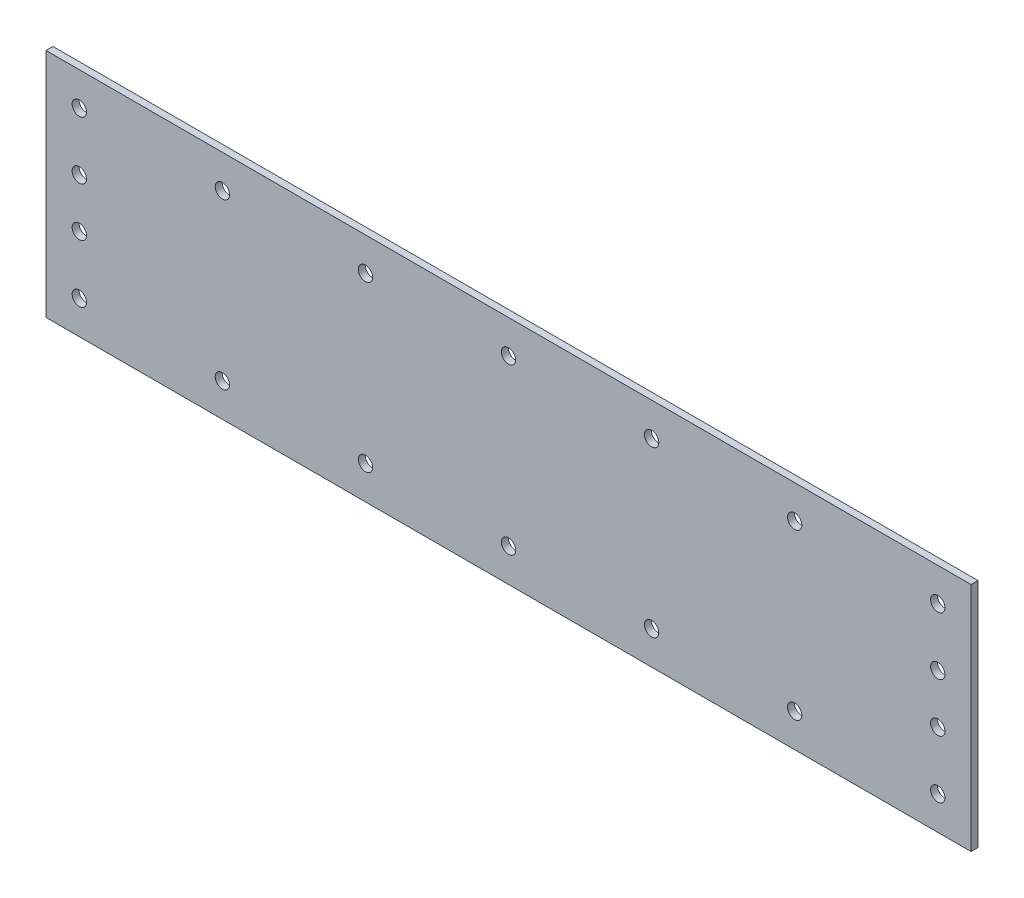
ISO-10303-21;
HEADER;
FILE_DESCRIPTION(('STEP AP214'),'2;1');
FILE_NAME('part.step','',(''),(''),'','','');
FILE_SCHEMA(('AUTOMOTIVE_DESIGN { 1 0 10303 214 1 1 1 1 }'));
ENDSEC;
DATA;
#1=APPLICATION_CONTEXT('core data for automotive mechanical design processes');
#2=APPLICATION_PROTOCOL_DEFINITION('international standard','automotive_design',2000,#1);
#3=PRODUCT_CONTEXT('',#1,'mechanical');
#4=PRODUCT('Part','Part','',(#3));
#5=PRODUCT_RELATED_PRODUCT_CATEGORY('part','',(#4));
#6=PRODUCT_DEFINITION_FORMATION('','',#4);
#7=PRODUCT_DEFINITION_CONTEXT('part definition',#1,'design');
#8=PRODUCT_DEFINITION('design','',#6,#7);
#9=PRODUCT_DEFINITION_SHAPE('','',#8);
#10=(LENGTH_UNIT() NAMED_UNIT(*) SI_UNIT(.MILLI.,.METRE.));
#11=(NAMED_UNIT(*) PLANE_ANGLE_UNIT() SI_UNIT($,.RADIAN.));
#12=(NAMED_UNIT(*) SI_UNIT($,.STERADIAN.) SOLID_ANGLE_UNIT());
#13=UNCERTAINTY_MEASURE_WITH_UNIT(LENGTH_MEASURE(1.E-05),#10,'distance_accuracy_value','');
#14=(GEOMETRIC_REPRESENTATION_CONTEXT(3) GLOBAL_UNCERTAINTY_ASSIGNED_CONTEXT((#13)) GLOBAL_UNIT_ASSIGNED_CONTEXT((#10,
#11,#12)) REPRESENTATION_CONTEXT('',''));
#15=CARTESIAN_POINT('',(0.,0.,0.));
#16=DIRECTION('',(0.,0.,1.));
#17=DIRECTION('',(1.,0.,0.));
#18=AXIS2_PLACEMENT_3D('',#15,#16,#17);
#19=CARTESIAN_POINT('',(200.,0.,-228.));
#20=DIRECTION('',(-1.,0.,0.));
#21=DIRECTION('',(0.,0.,1.));
#22=AXIS2_PLACEMENT_3D('',#19,#20,#21);
#23=PLANE('',#22);
#24=DIRECTION('',(0.,-1.,0.));
#25=VECTOR('',#24,1.);
#26=CARTESIAN_POINT('',(200.,0.,-225.));
#27=LINE('',#26,#25);
#28=CARTESIAN_POINT('',(200.,50.,-225.));
#29=VERTEX_POINT('',#28);
#30=CARTESIAN_POINT('',(200.,-50.,-225.));
#31=VERTEX_POINT('',#30);
#32=EDGE_CURVE('E163',#29,#31,#27,.T.);
#33=ORIENTED_EDGE('',*,*,#32,.T.);
#34=DIRECTION('',(0.,0.,1.));
#35=VECTOR('',#34,1.);
#36=CARTESIAN_POINT('',(200.,-50.,-228.));
#37=LINE('',#36,#35);
#38=CARTESIAN_POINT('',(200.,-50.,-228.));
#39=VERTEX_POINT('',#38);
#40=EDGE_CURVE('E11',#39,#31,#37,.T.);
#41=ORIENTED_EDGE('',*,*,#40,.F.);
#42=DIRECTION('',(0.,-1.,0.));
#43=VECTOR('',#42,1.);
#44=CARTESIAN_POINT('',(200.,0.,-228.));
#45=LINE('',#44,#43);
#46=CARTESIAN_POINT('',(200.,50.,-228.));
#47=VERTEX_POINT('',#46);
#48=EDGE_CURVE('E64',#47,#39,#45,.T.);
#49=ORIENTED_EDGE('',*,*,#48,.F.);
#50=DIRECTION('',(0.,0.,1.));
#51=VECTOR('',#50,1.);
#52=CARTESIAN_POINT('',(200.,50.,-228.));
#53=LINE('',#52,#51);
#54=EDGE_CURVE('E49',#47,#29,#53,.T.);
#55=ORIENTED_EDGE('',*,*,#54,.T.);
#56=EDGE_LOOP('',(#33,#41,#49,#55));
#57=FACE_BOUND('',#56,.T.);
#58=ADVANCED_FACE('F45',(#57),#23,.F.);
#59=CARTESIAN_POINT('',(0.,-50.,-228.));
#60=DIRECTION('',(0.,-1.,0.));
#61=DIRECTION('',(0.,0.,-1.));
#62=AXIS2_PLACEMENT_3D('',#59,#60,#61);
#63=PLANE('',#62);
#64=DIRECTION('',(1.,0.,0.));
#65=VECTOR('',#64,1.);
#66=CARTESIAN_POINT('',(0.,-50.,-225.));
#67=LINE('',#66,#65);
#68=CARTESIAN_POINT('',(-200.,-50.,-225.));
#69=VERTEX_POINT('',#68);
#70=EDGE_CURVE('E168',#69,#31,#67,.T.);
#71=ORIENTED_EDGE('',*,*,#70,.F.);
#72=DIRECTION('',(0.,0.,1.));
#73=VECTOR('',#72,1.);
#74=CARTESIAN_POINT('',(-200.,-50.,-228.));
#75=LINE('',#74,#73);
#76=CARTESIAN_POINT('',(-200.,-50.,-228.));
#77=VERTEX_POINT('',#76);
#78=EDGE_CURVE('E55',#77,#69,#75,.T.);
#79=ORIENTED_EDGE('',*,*,#78,.F.);
#80=DIRECTION('',(1.,0.,0.));
#81=VECTOR('',#80,1.);
#82=CARTESIAN_POINT('',(0.,-50.,-228.));
#83=LINE('',#82,#81);
#84=EDGE_CURVE('E104',#77,#39,#83,.T.);
#85=ORIENTED_EDGE('',*,*,#84,.T.);
#86=ORIENTED_EDGE('',*,*,#40,.T.);
#87=EDGE_LOOP('',(#71,#79,#85,#86));
#88=FACE_BOUND('',#87,.T.);
#89=ADVANCED_FACE('F249',(#88),#63,.T.);
#90=CARTESIAN_POINT('',(-200.,0.,-228.));
#91=DIRECTION('',(-1.,0.,0.));
#92=DIRECTION('',(0.,0.,1.));
#93=AXIS2_PLACEMENT_3D('',#90,#91,#92);
#94=PLANE('',#93);
#95=DIRECTION('',(0.,-1.,0.));
#96=VECTOR('',#95,1.);
#97=CARTESIAN_POINT('',(-200.,0.,-225.));
#98=LINE('',#97,#96);
#99=CARTESIAN_POINT('',(-200.,50.,-225.));
#100=VERTEX_POINT('',#99);
#101=EDGE_CURVE('E96',#100,#69,#98,.T.);
#102=ORIENTED_EDGE('',*,*,#101,.F.);
#103=DIRECTION('',(0.,0.,1.));
#104=VECTOR('',#103,1.);
#105=CARTESIAN_POINT('',(-200.,50.,-228.));
#106=LINE('',#105,#104);
#107=CARTESIAN_POINT('',(-200.,50.,-228.));
#108=VERTEX_POINT('',#107);
#109=EDGE_CURVE('E93',#108,#100,#106,.T.);
#110=ORIENTED_EDGE('',*,*,#109,.F.);
#111=DIRECTION('',(0.,-1.,0.));
#112=VECTOR('',#111,1.);
#113=CARTESIAN_POINT('',(-200.,0.,-228.));
#114=LINE('',#113,#112);
#115=EDGE_CURVE('E95',#108,#77,#114,.T.);
#116=ORIENTED_EDGE('',*,*,#115,.T.);
#117=ORIENTED_EDGE('',*,*,#78,.T.);
#118=EDGE_LOOP('',(#102,#110,#116,#117));
#119=FACE_BOUND('',#118,.T.);
#120=ADVANCED_FACE('F94',(#119),#94,.T.);
#121=CARTESIAN_POINT('',(123.733333333333,35.6000000000043,-228.));
#122=DIRECTION('',(0.,0.,1.));
#123=DIRECTION('',(1.,0.,0.));
#124=AXIS2_PLACEMENT_3D('',#121,#122,#123);
#125=CYLINDRICAL_SURFACE('',#124,3.09999999999999);
#126=CARTESIAN_POINT('',(123.733333333333,35.6000000000043,-228.));
#127=DIRECTION('',(0.,0.,1.));
#128=DIRECTION('',(1.,0.,0.));
#129=AXIS2_PLACEMENT_3D('',#126,#127,#128);
#130=CIRCLE('',#129,3.09999999999999);
#131=CARTESIAN_POINT('',(126.833333333333,35.6000000000043,-228.));
#132=VERTEX_POINT('',#131);
#133=EDGE_CURVE('E139',#132,#132,#130,.T.);
#134=ORIENTED_EDGE('',*,*,#133,.F.);
#135=EDGE_LOOP('',(#134));
#136=FACE_BOUND('',#135,.T.);
#137=CARTESIAN_POINT('',(123.733333333333,35.6000000000043,-225.));
#138=DIRECTION('',(0.,0.,1.));
#139=DIRECTION('',(1.,0.,0.));
#140=AXIS2_PLACEMENT_3D('',#137,#138,#139);
#141=CIRCLE('',#140,3.09999999999999);
#142=CARTESIAN_POINT('',(126.833333333333,35.6000000000043,-225.));
#143=VERTEX_POINT('',#142);
#144=EDGE_CURVE('E201',#143,#143,#141,.T.);
#145=ORIENTED_EDGE('',*,*,#144,.T.);
#146=EDGE_LOOP('',(#145));
#147=FACE_BOUND('',#146,.T.);
#148=ADVANCED_FACE('F315',(#136,#147),#125,.F.);
#149=CARTESIAN_POINT('',(0.,-35.5999999999974,-228.));
#150=DIRECTION('',(0.,0.,1.));
#151=DIRECTION('',(1.,0.,0.));
#152=AXIS2_PLACEMENT_3D('',#149,#150,#151);
#153=CYLINDRICAL_SURFACE('',#152,3.09999999999999);
#154=CARTESIAN_POINT('',(0.,-35.5999999999974,-228.));
#155=DIRECTION('',(0.,0.,1.));
#156=DIRECTION('',(1.,0.,0.));
#157=AXIS2_PLACEMENT_3D('',#154,#155,#156);
#158=CIRCLE('',#157,3.09999999999999);
#159=CARTESIAN_POINT('',(3.09999999999996,-35.5999999999974,-228.));
#160=VERTEX_POINT('',#159);
#161=EDGE_CURVE('E136',#160,#160,#158,.F.);
#162=ORIENTED_EDGE('',*,*,#161,.T.);
#163=EDGE_LOOP('',(#162));
#164=FACE_BOUND('',#163,.T.);
#165=CARTESIAN_POINT('',(0.,-35.5999999999974,-225.));
#166=DIRECTION('',(0.,0.,1.));
#167=DIRECTION('',(1.,0.,0.));
#168=AXIS2_PLACEMENT_3D('',#165,#166,#167);
#169=CIRCLE('',#168,3.09999999999999);
#170=CARTESIAN_POINT('',(3.09999999999996,-35.5999999999974,-225.));
#171=VERTEX_POINT('',#170);
#172=EDGE_CURVE('E198',#171,#171,#169,.F.);
#173=ORIENTED_EDGE('',*,*,#172,.F.);
#174=EDGE_LOOP('',(#173));
#175=FACE_BOUND('',#174,.T.);
#176=ADVANCED_FACE('F317',(#164,#175),#153,.F.);
#177=CARTESIAN_POINT('',(0.,35.6000000000026,-228.));
#178=DIRECTION('',(0.,0.,1.));
#179=DIRECTION('',(1.,0.,0.));
#180=AXIS2_PLACEMENT_3D('',#177,#178,#179);
#181=CYLINDRICAL_SURFACE('',#180,3.09999999999999);
#182=CARTESIAN_POINT('',(0.,35.6000000000026,-228.));
#183=DIRECTION('',(0.,0.,1.));
#184=DIRECTION('',(1.,0.,0.));
#185=AXIS2_PLACEMENT_3D('',#182,#183,#184);
#186=CIRCLE('',#185,3.09999999999999);
#187=CARTESIAN_POINT('',(3.09999999999996,35.6000000000026,-228.));
#188=VERTEX_POINT('',#187);
#189=EDGE_CURVE('E133',#188,#188,#186,.T.);
#190=ORIENTED_EDGE('',*,*,#189,.F.);
#191=EDGE_LOOP('',(#190));
#192=FACE_BOUND('',#191,.T.);
#193=CARTESIAN_POINT('',(0.,35.6000000000026,-225.));
#194=DIRECTION('',(0.,0.,1.));
#195=DIRECTION('',(1.,0.,0.));
#196=AXIS2_PLACEMENT_3D('',#193,#194,#195);
#197=CIRCLE('',#196,3.09999999999999);
#198=CARTESIAN_POINT('',(3.09999999999996,35.6000000000026,-225.));
#199=VERTEX_POINT('',#198);
#200=EDGE_CURVE('E195',#199,#199,#197,.T.);
#201=ORIENTED_EDGE('',*,*,#200,.T.);
#202=EDGE_LOOP('',(#201));
#203=FACE_BOUND('',#202,.T.);
#204=ADVANCED_FACE('F324',(#192,#203),#181,.F.);
#205=CARTESIAN_POINT('',(-123.733333333333,-35.5999999999991,-228.));
#206=DIRECTION('',(0.,0.,1.));
#207=DIRECTION('',(1.,0.,0.));
#208=AXIS2_PLACEMENT_3D('',#205,#206,#207);
#209=CYLINDRICAL_SURFACE('',#208,3.09999999999999);
#210=CARTESIAN_POINT('',(-123.733333333333,-35.5999999999991,-228.));
#211=DIRECTION('',(0.,0.,1.));
#212=DIRECTION('',(1.,0.,0.));
#213=AXIS2_PLACEMENT_3D('',#210,#211,#212);
#214=CIRCLE('',#213,3.09999999999999);
#215=CARTESIAN_POINT('',(-120.633333333333,-35.5999999999991,-228.));
#216=VERTEX_POINT('',#215);
#217=EDGE_CURVE('E130',#216,#216,#214,.F.);
#218=ORIENTED_EDGE('',*,*,#217,.T.);
#219=EDGE_LOOP('',(#218));
#220=FACE_BOUND('',#219,.T.);
#221=CARTESIAN_POINT('',(-123.733333333333,-35.5999999999991,-225.));
#222=DIRECTION('',(0.,0.,1.));
#223=DIRECTION('',(1.,0.,0.));
#224=AXIS2_PLACEMENT_3D('',#221,#222,#223);
#225=CIRCLE('',#224,3.09999999999999);
#226=CARTESIAN_POINT('',(-120.633333333333,-35.5999999999991,-225.));
#227=VERTEX_POINT('',#226);
#228=EDGE_CURVE('E192',#227,#227,#225,.F.);
#229=ORIENTED_EDGE('',*,*,#228,.F.);
#230=EDGE_LOOP('',(#229));
#231=FACE_BOUND('',#230,.T.);
#232=ADVANCED_FACE('F331',(#220,#231),#209,.F.);
#233=CARTESIAN_POINT('',(-123.733333333333,35.6000000000009,-228.));
#234=DIRECTION('',(0.,0.,1.));
#235=DIRECTION('',(1.,0.,0.));
#236=AXIS2_PLACEMENT_3D('',#233,#234,#235);
#237=CYLINDRICAL_SURFACE('',#236,3.09999999999999);
#238=CARTESIAN_POINT('',(-123.733333333333,35.6000000000009,-228.));
#239=DIRECTION('',(0.,0.,1.));
#240=DIRECTION('',(1.,0.,0.));
#241=AXIS2_PLACEMENT_3D('',#238,#239,#240);
#242=CIRCLE('',#241,3.09999999999999);
#243=CARTESIAN_POINT('',(-120.633333333333,35.6000000000009,-228.));
#244=VERTEX_POINT('',#243);
#245=EDGE_CURVE('E127',#244,#244,#242,.T.);
#246=ORIENTED_EDGE('',*,*,#245,.F.);
#247=EDGE_LOOP('',(#246));
#248=FACE_BOUND('',#247,.T.);
#249=CARTESIAN_POINT('',(-123.733333333333,35.6000000000009,-225.));
#250=DIRECTION('',(0.,0.,1.));
#251=DIRECTION('',(1.,0.,0.));
#252=AXIS2_PLACEMENT_3D('',#249,#250,#251);
#253=CIRCLE('',#252,3.09999999999999);
#254=CARTESIAN_POINT('',(-120.633333333333,35.6000000000009,-225.));
#255=VERTEX_POINT('',#254);
#256=EDGE_CURVE('E189',#255,#255,#253,.T.);
#257=ORIENTED_EDGE('',*,*,#256,.T.);
#258=EDGE_LOOP('',(#257));
#259=FACE_BOUND('',#258,.T.);
#260=ADVANCED_FACE('F335',(#248,#259),#237,.F.);
#261=CARTESIAN_POINT('',(185.599999999999,10.6,-228.));
#262=DIRECTION('',(0.,0.,1.));
#263=DIRECTION('',(1.,0.,0.));
#264=AXIS2_PLACEMENT_3D('',#261,#262,#263);
#265=CYLINDRICAL_SURFACE('',#264,3.09999999999999);
#266=CARTESIAN_POINT('',(185.599999999999,10.6,-228.));
#267=DIRECTION('',(0.,0.,1.));
#268=DIRECTION('',(1.,0.,0.));
#269=AXIS2_PLACEMENT_3D('',#266,#267,#268);
#270=CIRCLE('',#269,3.09999999999999);
#271=CARTESIAN_POINT('',(188.699999999999,10.6,-228.));
#272=VERTEX_POINT('',#271);
#273=EDGE_CURVE('E124',#272,#272,#270,.F.);
#274=ORIENTED_EDGE('',*,*,#273,.T.);
#275=EDGE_LOOP('',(#274));
#276=FACE_BOUND('',#275,.T.);
#277=CARTESIAN_POINT('',(185.599999999999,10.6,-225.));
#278=DIRECTION('',(0.,0.,1.));
#279=DIRECTION('',(1.,0.,0.));
#280=AXIS2_PLACEMENT_3D('',#277,#278,#279);
#281=CIRCLE('',#280,3.09999999999999);
#282=CARTESIAN_POINT('',(188.699999999999,10.6,-225.));
#283=VERTEX_POINT('',#282);
#284=EDGE_CURVE('E186',#283,#283,#281,.F.);
#285=ORIENTED_EDGE('',*,*,#284,.F.);
#286=EDGE_LOOP('',(#285));
#287=FACE_BOUND('',#286,.T.);
#288=ADVANCED_FACE('F339',(#276,#287),#265,.F.);
#289=CARTESIAN_POINT('',(185.599999999999,-10.6,-228.));
#290=DIRECTION('',(0.,0.,1.));
#291=DIRECTION('',(1.,0.,0.));
#292=AXIS2_PLACEMENT_3D('',#289,#290,#291);
#293=CYLINDRICAL_SURFACE('',#292,3.09999999999999);
#294=CARTESIAN_POINT('',(185.599999999999,-10.6,-228.));
#295=DIRECTION('',(0.,0.,1.));
#296=DIRECTION('',(1.,0.,0.));
#297=AXIS2_PLACEMENT_3D('',#294,#295,#296);
#298=CIRCLE('',#297,3.09999999999999);
#299=CARTESIAN_POINT('',(188.699999999999,-10.6,-228.));
#300=VERTEX_POINT('',#299);
#301=EDGE_CURVE('E121',#300,#300,#298,.T.);
#302=ORIENTED_EDGE('',*,*,#301,.F.);
#303=EDGE_LOOP('',(#302));
#304=FACE_BOUND('',#303,.T.);
#305=CARTESIAN_POINT('',(185.599999999999,-10.6,-225.));
#306=DIRECTION('',(0.,0.,1.));
#307=DIRECTION('',(1.,0.,0.));
#308=AXIS2_PLACEMENT_3D('',#305,#306,#307);
#309=CIRCLE('',#308,3.09999999999999);
#310=CARTESIAN_POINT('',(188.699999999999,-10.6,-225.));
#311=VERTEX_POINT('',#310);
#312=EDGE_CURVE('E183',#311,#311,#309,.T.);
#313=ORIENTED_EDGE('',*,*,#312,.T.);
#314=EDGE_LOOP('',(#313));
#315=FACE_BOUND('',#314,.T.);
#316=ADVANCED_FACE('F343',(#304,#315),#293,.F.);
#317=CARTESIAN_POINT('',(185.6,-35.6,-228.));
#318=DIRECTION('',(0.,0.,1.));
#319=DIRECTION('',(1.,0.,0.));
#320=AXIS2_PLACEMENT_3D('',#317,#318,#319);
#321=CYLINDRICAL_SURFACE('',#320,3.09999999999999);
#322=CARTESIAN_POINT('',(185.6,-35.6,-228.));
#323=DIRECTION('',(0.,0.,1.));
#324=DIRECTION('',(1.,0.,0.));
#325=AXIS2_PLACEMENT_3D('',#322,#323,#324);
#326=CIRCLE('',#325,3.09999999999999);
#327=CARTESIAN_POINT('',(188.7,-35.6,-228.));
#328=VERTEX_POINT('',#327);
#329=EDGE_CURVE('E118',#328,#328,#326,.T.);
#330=ORIENTED_EDGE('',*,*,#329,.F.);
#331=EDGE_LOOP('',(#330));
#332=FACE_BOUND('',#331,.T.);
#333=CARTESIAN_POINT('',(185.6,-35.6,-225.));
#334=DIRECTION('',(0.,0.,1.));
#335=DIRECTION('',(1.,0.,0.));
#336=AXIS2_PLACEMENT_3D('',#333,#334,#335);
#337=CIRCLE('',#336,3.09999999999999);
#338=CARTESIAN_POINT('',(188.7,-35.6,-225.));
#339=VERTEX_POINT('',#338);
#340=EDGE_CURVE('E180',#339,#339,#337,.T.);
#341=ORIENTED_EDGE('',*,*,#340,.T.);
#342=EDGE_LOOP('',(#341));
#343=FACE_BOUND('',#342,.T.);
#344=ADVANCED_FACE('F347',(#332,#343),#321,.F.);
#345=CARTESIAN_POINT('',(-185.599999999999,-10.6,-228.));
#346=DIRECTION('',(0.,0.,1.));
#347=DIRECTION('',(1.,0.,0.));
#348=AXIS2_PLACEMENT_3D('',#345,#346,#347);
#349=CYLINDRICAL_SURFACE('',#348,3.09999999999999);
#350=CARTESIAN_POINT('',(-185.599999999999,-10.6,-228.));
#351=DIRECTION('',(0.,0.,1.));
#352=DIRECTION('',(1.,0.,0.));
#353=AXIS2_PLACEMENT_3D('',#350,#351,#352);
#354=CIRCLE('',#353,3.09999999999999);
#355=CARTESIAN_POINT('',(-182.499999999999,-10.6,-228.));
#356=VERTEX_POINT('',#355);
#357=EDGE_CURVE('E115',#356,#356,#354,.F.);
#358=ORIENTED_EDGE('',*,*,#357,.T.);
#359=EDGE_LOOP('',(#358));
#360=FACE_BOUND('',#359,.T.);
#361=CARTESIAN_POINT('',(-185.599999999999,-10.6,-225.));
#362=DIRECTION('',(0.,0.,1.));
#363=DIRECTION('',(1.,0.,0.));
#364=AXIS2_PLACEMENT_3D('',#361,#362,#363);
#365=CIRCLE('',#364,3.09999999999999);
#366=CARTESIAN_POINT('',(-182.499999999999,-10.6,-225.));
#367=VERTEX_POINT('',#366);
#368=EDGE_CURVE('E177',#367,#367,#365,.F.);
#369=ORIENTED_EDGE('',*,*,#368,.F.);
#370=EDGE_LOOP('',(#369));
#371=FACE_BOUND('',#370,.T.);
#372=ADVANCED_FACE('F351',(#360,#371),#349,.F.);
#373=CARTESIAN_POINT('',(-185.599999999999,10.6,-228.));
#374=DIRECTION('',(0.,0.,1.));
#375=DIRECTION('',(1.,0.,0.));
#376=AXIS2_PLACEMENT_3D('',#373,#374,#375);
#377=CYLINDRICAL_SURFACE('',#376,3.09999999999943);
#378=CARTESIAN_POINT('',(-185.599999999999,10.6,-228.));
#379=DIRECTION('',(0.,0.,1.));
#380=DIRECTION('',(1.,0.,0.));
#381=AXIS2_PLACEMENT_3D('',#378,#379,#380);
#382=CIRCLE('',#381,3.09999999999943);
#383=CARTESIAN_POINT('',(-182.5,10.6,-228.));
#384=VERTEX_POINT('',#383);
#385=EDGE_CURVE('E112',#384,#384,#382,.T.);
#386=ORIENTED_EDGE('',*,*,#385,.F.);
#387=EDGE_LOOP('',(#386));
#388=FACE_BOUND('',#387,.T.);
#389=CARTESIAN_POINT('',(-185.599999999999,10.6,-225.));
#390=DIRECTION('',(0.,0.,1.));
#391=DIRECTION('',(1.,0.,0.));
#392=AXIS2_PLACEMENT_3D('',#389,#390,#391);
#393=CIRCLE('',#392,3.09999999999943);
#394=CARTESIAN_POINT('',(-182.5,10.6,-225.));
#395=VERTEX_POINT('',#394);
#396=EDGE_CURVE('E174',#395,#395,#393,.T.);
#397=ORIENTED_EDGE('',*,*,#396,.T.);
#398=EDGE_LOOP('',(#397));
#399=FACE_BOUND('',#398,.T.);
#400=ADVANCED_FACE('F355',(#388,#399),#377,.F.);
#401=CARTESIAN_POINT('',(-185.6,35.6,-228.));
#402=DIRECTION('',(0.,0.,1.));
#403=DIRECTION('',(1.,0.,0.));
#404=AXIS2_PLACEMENT_3D('',#401,#402,#403);
#405=CYLINDRICAL_SURFACE('',#404,3.09999999999999);
#406=CARTESIAN_POINT('',(-185.6,35.6,-228.));
#407=DIRECTION('',(0.,0.,1.));
#408=DIRECTION('',(1.,0.,0.));
#409=AXIS2_PLACEMENT_3D('',#406,#407,#408);
#410=CIRCLE('',#409,3.09999999999999);
#411=CARTESIAN_POINT('',(-182.5,35.6,-228.));
#412=VERTEX_POINT('',#411);
#413=EDGE_CURVE('E106',#412,#412,#410,.T.);
#414=ORIENTED_EDGE('',*,*,#413,.F.);
#415=EDGE_LOOP('',(#414));
#416=FACE_BOUND('',#415,.T.);
#417=CARTESIAN_POINT('',(-185.6,35.6,-225.));
#418=DIRECTION('',(0.,0.,1.));
#419=DIRECTION('',(1.,0.,0.));
#420=AXIS2_PLACEMENT_3D('',#417,#418,#419);
#421=CIRCLE('',#420,3.09999999999999);
#422=CARTESIAN_POINT('',(-182.5,35.6,-225.));
#423=VERTEX_POINT('',#422);
#424=EDGE_CURVE('E171',#423,#423,#421,.T.);
#425=ORIENTED_EDGE('',*,*,#424,.T.);
#426=EDGE_LOOP('',(#425));
#427=FACE_BOUND('',#426,.T.);
#428=ADVANCED_FACE('F359',(#416,#427),#405,.F.);
#429=CARTESIAN_POINT('',(0.,50.,-228.));
#430=DIRECTION('',(0.,-1.,0.));
#431=DIRECTION('',(0.,0.,-1.));
#432=AXIS2_PLACEMENT_3D('',#429,#430,#431);
#433=PLANE('',#432);
#434=DIRECTION('',(1.,0.,0.));
#435=VECTOR('',#434,1.);
#436=CARTESIAN_POINT('',(0.,50.,-225.));
#437=LINE('',#436,#435);
#438=EDGE_CURVE('E165',#100,#29,#437,.T.);
#439=ORIENTED_EDGE('',*,*,#438,.T.);
#440=ORIENTED_EDGE('',*,*,#54,.F.);
#441=DIRECTION('',(1.,0.,0.));
#442=VECTOR('',#441,1.);
#443=CARTESIAN_POINT('',(0.,50.,-228.));
#444=LINE('',#443,#442);
#445=EDGE_CURVE('E90',#108,#47,#444,.T.);
#446=ORIENTED_EDGE('',*,*,#445,.F.);
#447=ORIENTED_EDGE('',*,*,#109,.T.);
#448=EDGE_LOOP('',(#439,#440,#446,#447));
#449=FACE_BOUND('',#448,.T.);
#450=ADVANCED_FACE('F99',(#449),#433,.F.);
#451=CARTESIAN_POINT('',(-185.6,-35.6,-228.));
#452=DIRECTION('',(0.,0.,1.));
#453=DIRECTION('',(1.,0.,0.));
#454=AXIS2_PLACEMENT_3D('',#451,#452,#453);
#455=CYLINDRICAL_SURFACE('',#454,3.09999999999999);
#456=CARTESIAN_POINT('',(-185.6,-35.6,-228.));
#457=DIRECTION('',(0.,0.,1.));
#458=DIRECTION('',(1.,0.,0.));
#459=AXIS2_PLACEMENT_3D('',#456,#457,#458);
#460=CIRCLE('',#459,3.09999999999999);
#461=CARTESIAN_POINT('',(-182.5,-35.6,-228.));
#462=VERTEX_POINT('',#461);
#463=EDGE_CURVE('E227',#462,#462,#460,.F.);
#464=ORIENTED_EDGE('',*,*,#463,.T.);
#465=EDGE_LOOP('',(#464));
#466=FACE_BOUND('',#465,.T.);
#467=CARTESIAN_POINT('',(-185.6,-35.6,-225.));
#468=DIRECTION('',(0.,0.,1.));
#469=DIRECTION('',(1.,0.,0.));
#470=AXIS2_PLACEMENT_3D('',#467,#468,#469);
#471=CIRCLE('',#470,3.09999999999999);
#472=CARTESIAN_POINT('',(-182.5,-35.6,-225.));
#473=VERTEX_POINT('',#472);
#474=EDGE_CURVE('E160',#473,#473,#471,.F.);
#475=ORIENTED_EDGE('',*,*,#474,.F.);
#476=EDGE_LOOP('',(#475));
#477=FACE_BOUND('',#476,.T.);
#478=ADVANCED_FACE('F231',(#466,#477),#455,.F.);
#479=CARTESIAN_POINT('',(185.6,35.6,-228.));
#480=DIRECTION('',(0.,0.,1.));
#481=DIRECTION('',(1.,0.,0.));
#482=AXIS2_PLACEMENT_3D('',#479,#480,#481);
#483=CYLINDRICAL_SURFACE('',#482,3.09999999999999);
#484=CARTESIAN_POINT('',(185.6,35.6,-228.));
#485=DIRECTION('',(0.,0.,1.));
#486=DIRECTION('',(1.,0.,0.));
#487=AXIS2_PLACEMENT_3D('',#484,#485,#486);
#488=CIRCLE('',#487,3.09999999999999);
#489=CARTESIAN_POINT('',(188.7,35.6,-228.));
#490=VERTEX_POINT('',#489);
#491=EDGE_CURVE('E224',#490,#490,#488,.F.);
#492=ORIENTED_EDGE('',*,*,#491,.T.);
#493=EDGE_LOOP('',(#492));
#494=FACE_BOUND('',#493,.T.);
#495=CARTESIAN_POINT('',(185.6,35.6,-225.));
#496=DIRECTION('',(0.,0.,1.));
#497=DIRECTION('',(1.,0.,0.));
#498=AXIS2_PLACEMENT_3D('',#495,#496,#497);
#499=CIRCLE('',#498,3.09999999999999);
#500=CARTESIAN_POINT('',(188.7,35.6,-225.));
#501=VERTEX_POINT('',#500);
#502=EDGE_CURVE('E157',#501,#501,#499,.F.);
#503=ORIENTED_EDGE('',*,*,#502,.F.);
#504=EDGE_LOOP('',(#503));
#505=FACE_BOUND('',#504,.T.);
#506=ADVANCED_FACE('F261',(#494,#505),#483,.F.);
#507=CARTESIAN_POINT('',(-61.8666666666666,35.6000000000017,-228.));
#508=DIRECTION('',(0.,0.,1.));
#509=DIRECTION('',(1.,0.,0.));
#510=AXIS2_PLACEMENT_3D('',#507,#508,#509);
#511=CYLINDRICAL_SURFACE('',#510,3.09999999999999);
#512=CARTESIAN_POINT('',(-61.8666666666666,35.6000000000017,-228.));
#513=DIRECTION('',(0.,0.,1.));
#514=DIRECTION('',(1.,0.,0.));
#515=AXIS2_PLACEMENT_3D('',#512,#513,#514);
#516=CIRCLE('',#515,3.09999999999999);
#517=CARTESIAN_POINT('',(-58.7666666666666,35.6000000000017,-228.));
#518=VERTEX_POINT('',#517);
#519=EDGE_CURVE('E221',#518,#518,#516,.T.);
#520=ORIENTED_EDGE('',*,*,#519,.F.);
#521=EDGE_LOOP('',(#520));
#522=FACE_BOUND('',#521,.T.);
#523=CARTESIAN_POINT('',(-61.8666666666666,35.6000000000017,-225.));
#524=DIRECTION('',(0.,0.,1.));
#525=DIRECTION('',(1.,0.,0.));
#526=AXIS2_PLACEMENT_3D('',#523,#524,#525);
#527=CIRCLE('',#526,3.09999999999999);
#528=CARTESIAN_POINT('',(-58.7666666666666,35.6000000000017,-225.));
#529=VERTEX_POINT('',#528);
#530=EDGE_CURVE('E154',#529,#529,#527,.T.);
#531=ORIENTED_EDGE('',*,*,#530,.T.);
#532=EDGE_LOOP('',(#531));
#533=FACE_BOUND('',#532,.T.);
#534=ADVANCED_FACE('F264',(#522,#533),#511,.F.);
#535=CARTESIAN_POINT('',(-61.8666666666666,-35.5999999999983,-228.));
#536=DIRECTION('',(0.,0.,1.));
#537=DIRECTION('',(1.,0.,0.));
#538=AXIS2_PLACEMENT_3D('',#535,#536,#537);
#539=CYLINDRICAL_SURFACE('',#538,3.09999999999999);
#540=CARTESIAN_POINT('',(-61.8666666666666,-35.5999999999983,-228.));
#541=DIRECTION('',(0.,0.,1.));
#542=DIRECTION('',(1.,0.,0.));
#543=AXIS2_PLACEMENT_3D('',#540,#541,#542);
#544=CIRCLE('',#543,3.09999999999999);
#545=CARTESIAN_POINT('',(-58.7666666666666,-35.5999999999983,-228.));
#546=VERTEX_POINT('',#545);
#547=EDGE_CURVE('E216',#546,#546,#544,.F.);
#548=ORIENTED_EDGE('',*,*,#547,.T.);
#549=EDGE_LOOP('',(#548));
#550=FACE_BOUND('',#549,.T.);
#551=CARTESIAN_POINT('',(-61.8666666666666,-35.5999999999983,-225.));
#552=DIRECTION('',(0.,0.,1.));
#553=DIRECTION('',(1.,0.,0.));
#554=AXIS2_PLACEMENT_3D('',#551,#552,#553);
#555=CIRCLE('',#554,3.09999999999999);
#556=CARTESIAN_POINT('',(-58.7666666666666,-35.5999999999983,-225.));
#557=VERTEX_POINT('',#556);
#558=EDGE_CURVE('E151',#557,#557,#555,.F.);
#559=ORIENTED_EDGE('',*,*,#558,.F.);
#560=EDGE_LOOP('',(#559));
#561=FACE_BOUND('',#560,.T.);
#562=ADVANCED_FACE('F268',(#550,#561),#539,.F.);
#563=CARTESIAN_POINT('',(61.8666666666665,35.6000000000035,-228.));
#564=DIRECTION('',(0.,0.,1.));
#565=DIRECTION('',(1.,0.,0.));
#566=AXIS2_PLACEMENT_3D('',#563,#564,#565);
#567=CYLINDRICAL_SURFACE('',#566,3.09999999999999);
#568=CARTESIAN_POINT('',(61.8666666666665,35.6000000000035,-228.));
#569=DIRECTION('',(0.,0.,1.));
#570=DIRECTION('',(1.,0.,0.));
#571=AXIS2_PLACEMENT_3D('',#568,#569,#570);
#572=CIRCLE('',#571,3.09999999999999);
#573=CARTESIAN_POINT('',(64.9666666666665,35.6000000000035,-228.));
#574=VERTEX_POINT('',#573);
#575=EDGE_CURVE('E211',#574,#574,#572,.T.);
#576=ORIENTED_EDGE('',*,*,#575,.F.);
#577=EDGE_LOOP('',(#576));
#578=FACE_BOUND('',#577,.T.);
#579=CARTESIAN_POINT('',(61.8666666666665,35.6000000000035,-225.));
#580=DIRECTION('',(0.,0.,1.));
#581=DIRECTION('',(1.,0.,0.));
#582=AXIS2_PLACEMENT_3D('',#579,#580,#581);
#583=CIRCLE('',#582,3.09999999999999);
#584=CARTESIAN_POINT('',(64.9666666666665,35.6000000000035,-225.));
#585=VERTEX_POINT('',#584);
#586=EDGE_CURVE('E148',#585,#585,#583,.T.);
#587=ORIENTED_EDGE('',*,*,#586,.T.);
#588=EDGE_LOOP('',(#587));
#589=FACE_BOUND('',#588,.T.);
#590=ADVANCED_FACE('F271',(#578,#589),#567,.F.);
#591=CARTESIAN_POINT('',(61.8666666666665,-35.5999999999965,-228.));
#592=DIRECTION('',(0.,0.,1.));
#593=DIRECTION('',(1.,0.,0.));
#594=AXIS2_PLACEMENT_3D('',#591,#592,#593);
#595=CYLINDRICAL_SURFACE('',#594,3.09999999999999);
#596=CARTESIAN_POINT('',(61.8666666666665,-35.5999999999965,-228.));
#597=DIRECTION('',(0.,0.,1.));
#598=DIRECTION('',(1.,0.,0.));
#599=AXIS2_PLACEMENT_3D('',#596,#597,#598);
#600=CIRCLE('',#599,3.09999999999999);
#601=CARTESIAN_POINT('',(64.9666666666665,-35.5999999999965,-228.));
#602=VERTEX_POINT('',#601);
#603=EDGE_CURVE('E206',#602,#602,#600,.F.);
#604=ORIENTED_EDGE('',*,*,#603,.T.);
#605=EDGE_LOOP('',(#604));
#606=FACE_BOUND('',#605,.T.);
#607=CARTESIAN_POINT('',(61.8666666666665,-35.5999999999965,-225.));
#608=DIRECTION('',(0.,0.,1.));
#609=DIRECTION('',(1.,0.,0.));
#610=AXIS2_PLACEMENT_3D('',#607,#608,#609);
#611=CIRCLE('',#610,3.09999999999999);
#612=CARTESIAN_POINT('',(64.9666666666665,-35.5999999999965,-225.));
#613=VERTEX_POINT('',#612);
#614=EDGE_CURVE('E145',#613,#613,#611,.F.);
#615=ORIENTED_EDGE('',*,*,#614,.F.);
#616=EDGE_LOOP('',(#615));
#617=FACE_BOUND('',#616,.T.);
#618=ADVANCED_FACE('F47',(#606,#617),#595,.F.);
#619=CARTESIAN_POINT('',(123.733333333333,-35.5999999999957,-228.));
#620=DIRECTION('',(0.,0.,1.));
#621=DIRECTION('',(1.,0.,0.));
#622=AXIS2_PLACEMENT_3D('',#619,#620,#621);
#623=CYLINDRICAL_SURFACE('',#622,3.09999999999999);
#624=CARTESIAN_POINT('',(123.733333333333,-35.5999999999957,-228.));
#625=DIRECTION('',(0.,0.,1.));
#626=DIRECTION('',(1.,0.,0.));
#627=AXIS2_PLACEMENT_3D('',#624,#625,#626);
#628=CIRCLE('',#627,3.09999999999999);
#629=CARTESIAN_POINT('',(126.833333333333,-35.5999999999957,-228.));
#630=VERTEX_POINT('',#629);
#631=EDGE_CURVE('E142',#630,#630,#628,.F.);
#632=ORIENTED_EDGE('',*,*,#631,.T.);
#633=EDGE_LOOP('',(#632));
#634=FACE_BOUND('',#633,.T.);
#635=CARTESIAN_POINT('',(123.733333333333,-35.5999999999957,-225.));
#636=DIRECTION('',(0.,0.,1.));
#637=DIRECTION('',(1.,0.,0.));
#638=AXIS2_PLACEMENT_3D('',#635,#636,#637);
#639=CIRCLE('',#638,3.09999999999999);
#640=CARTESIAN_POINT('',(126.833333333333,-35.5999999999957,-225.));
#641=VERTEX_POINT('',#640);
#642=EDGE_CURVE('E204',#641,#641,#639,.F.);
#643=ORIENTED_EDGE('',*,*,#642,.F.);
#644=EDGE_LOOP('',(#643));
#645=FACE_BOUND('',#644,.T.);
#646=ADVANCED_FACE('F236',(#634,#645),#623,.F.);
#647=CARTESIAN_POINT('',(0.,0.,-228.));
#648=DIRECTION('',(0.,0.,1.));
#649=DIRECTION('',(1.,0.,0.));
#650=AXIS2_PLACEMENT_3D('',#647,#648,#649);
#651=PLANE('',#650);
#652=ORIENTED_EDGE('',*,*,#603,.F.);
#653=EDGE_LOOP('',(#652));
#654=FACE_BOUND('',#653,.T.);
#655=ORIENTED_EDGE('',*,*,#575,.T.);
#656=EDGE_LOOP('',(#655));
#657=FACE_BOUND('',#656,.T.);
#658=ORIENTED_EDGE('',*,*,#547,.F.);
#659=EDGE_LOOP('',(#658));
#660=FACE_BOUND('',#659,.T.);
#661=ORIENTED_EDGE('',*,*,#519,.T.);
#662=EDGE_LOOP('',(#661));
#663=FACE_BOUND('',#662,.T.);
#664=ORIENTED_EDGE('',*,*,#491,.F.);
#665=EDGE_LOOP('',(#664));
#666=FACE_BOUND('',#665,.T.);
#667=ORIENTED_EDGE('',*,*,#463,.F.);
#668=EDGE_LOOP('',(#667));
#669=FACE_BOUND('',#668,.T.);
#670=ORIENTED_EDGE('',*,*,#48,.T.);
#671=ORIENTED_EDGE('',*,*,#84,.F.);
#672=ORIENTED_EDGE('',*,*,#115,.F.);
#673=ORIENTED_EDGE('',*,*,#445,.T.);
#674=EDGE_LOOP('',(#670,#671,#672,#673));
#675=FACE_BOUND('',#674,.T.);
#676=ORIENTED_EDGE('',*,*,#413,.T.);
#677=EDGE_LOOP('',(#676));
#678=FACE_BOUND('',#677,.T.);
#679=ORIENTED_EDGE('',*,*,#385,.T.);
#680=EDGE_LOOP('',(#679));
#681=FACE_BOUND('',#680,.T.);
#682=ORIENTED_EDGE('',*,*,#357,.F.);
#683=EDGE_LOOP('',(#682));
#684=FACE_BOUND('',#683,.T.);
#685=ORIENTED_EDGE('',*,*,#329,.T.);
#686=EDGE_LOOP('',(#685));
#687=FACE_BOUND('',#686,.T.);
#688=ORIENTED_EDGE('',*,*,#301,.T.);
#689=EDGE_LOOP('',(#688));
#690=FACE_BOUND('',#689,.T.);
#691=ORIENTED_EDGE('',*,*,#273,.F.);
#692=EDGE_LOOP('',(#691));
#693=FACE_BOUND('',#692,.T.);
#694=ORIENTED_EDGE('',*,*,#245,.T.);
#695=EDGE_LOOP('',(#694));
#696=FACE_BOUND('',#695,.T.);
#697=ORIENTED_EDGE('',*,*,#217,.F.);
#698=EDGE_LOOP('',(#697));
#699=FACE_BOUND('',#698,.T.);
#700=ORIENTED_EDGE('',*,*,#189,.T.);
#701=EDGE_LOOP('',(#700));
#702=FACE_BOUND('',#701,.T.);
#703=ORIENTED_EDGE('',*,*,#161,.F.);
#704=EDGE_LOOP('',(#703));
#705=FACE_BOUND('',#704,.T.);
#706=ORIENTED_EDGE('',*,*,#133,.T.);
#707=EDGE_LOOP('',(#706));
#708=FACE_BOUND('',#707,.T.);
#709=ORIENTED_EDGE('',*,*,#631,.F.);
#710=EDGE_LOOP('',(#709));
#711=FACE_BOUND('',#710,.T.);
#712=ADVANCED_FACE('F102',(#654,#657,#660,#663,#666,#669,#675,#678,#681,#684,#687,#690,#693,
#696,#699,#702,#705,#708,#711),#651,.F.);
#713=CARTESIAN_POINT('',(0.,0.,-225.));
#714=DIRECTION('',(0.,0.,1.));
#715=DIRECTION('',(1.,0.,0.));
#716=AXIS2_PLACEMENT_3D('',#713,#714,#715);
#717=PLANE('',#716);
#718=ORIENTED_EDGE('',*,*,#614,.T.);
#719=EDGE_LOOP('',(#718));
#720=FACE_BOUND('',#719,.T.);
#721=ORIENTED_EDGE('',*,*,#586,.F.);
#722=EDGE_LOOP('',(#721));
#723=FACE_BOUND('',#722,.T.);
#724=ORIENTED_EDGE('',*,*,#558,.T.);
#725=EDGE_LOOP('',(#724));
#726=FACE_BOUND('',#725,.T.);
#727=ORIENTED_EDGE('',*,*,#530,.F.);
#728=EDGE_LOOP('',(#727));
#729=FACE_BOUND('',#728,.T.);
#730=ORIENTED_EDGE('',*,*,#502,.T.);
#731=EDGE_LOOP('',(#730));
#732=FACE_BOUND('',#731,.T.);
#733=ORIENTED_EDGE('',*,*,#474,.T.);
#734=EDGE_LOOP('',(#733));
#735=FACE_BOUND('',#734,.T.);
#736=ORIENTED_EDGE('',*,*,#32,.F.);
#737=ORIENTED_EDGE('',*,*,#438,.F.);
#738=ORIENTED_EDGE('',*,*,#101,.T.);
#739=ORIENTED_EDGE('',*,*,#70,.T.);
#740=EDGE_LOOP('',(#736,#737,#738,#739));
#741=FACE_BOUND('',#740,.T.);
#742=ORIENTED_EDGE('',*,*,#424,.F.);
#743=EDGE_LOOP('',(#742));
#744=FACE_BOUND('',#743,.T.);
#745=ORIENTED_EDGE('',*,*,#396,.F.);
#746=EDGE_LOOP('',(#745));
#747=FACE_BOUND('',#746,.T.);
#748=ORIENTED_EDGE('',*,*,#368,.T.);
#749=EDGE_LOOP('',(#748));
#750=FACE_BOUND('',#749,.T.);
#751=ORIENTED_EDGE('',*,*,#340,.F.);
#752=EDGE_LOOP('',(#751));
#753=FACE_BOUND('',#752,.T.);
#754=ORIENTED_EDGE('',*,*,#312,.F.);
#755=EDGE_LOOP('',(#754));
#756=FACE_BOUND('',#755,.T.);
#757=ORIENTED_EDGE('',*,*,#284,.T.);
#758=EDGE_LOOP('',(#757));
#759=FACE_BOUND('',#758,.T.);
#760=ORIENTED_EDGE('',*,*,#256,.F.);
#761=EDGE_LOOP('',(#760));
#762=FACE_BOUND('',#761,.T.);
#763=ORIENTED_EDGE('',*,*,#228,.T.);
#764=EDGE_LOOP('',(#763));
#765=FACE_BOUND('',#764,.T.);
#766=ORIENTED_EDGE('',*,*,#200,.F.);
#767=EDGE_LOOP('',(#766));
#768=FACE_BOUND('',#767,.T.);
#769=ORIENTED_EDGE('',*,*,#172,.T.);
#770=EDGE_LOOP('',(#769));
#771=FACE_BOUND('',#770,.T.);
#772=ORIENTED_EDGE('',*,*,#144,.F.);
#773=EDGE_LOOP('',(#772));
#774=FACE_BOUND('',#773,.T.);
#775=ORIENTED_EDGE('',*,*,#642,.T.);
#776=EDGE_LOOP('',(#775));
#777=FACE_BOUND('',#776,.T.);
#778=ADVANCED_FACE('F235',(#720,#723,#726,#729,#732,#735,#741,#744,#747,#750,#753,#756,#759,
#762,#765,#768,#771,#774,#777),#717,.T.);
#779=CLOSED_SHELL('',(#58,#89,#120,#148,#176,#204,#232,#260,#288,#316,#344,#372,#400,#428,#450,
#478,#506,#534,#562,#590,#618,#646,#712,#778));
#780=MANIFOLD_SOLID_BREP('B2',#779);
#781=ADVANCED_BREP_SHAPE_REPRESENTATION('',(#18,#780),#14);
#782=SHAPE_DEFINITION_REPRESENTATION(#9,#781);
ENDSEC;
END-ISO-10303-21;
